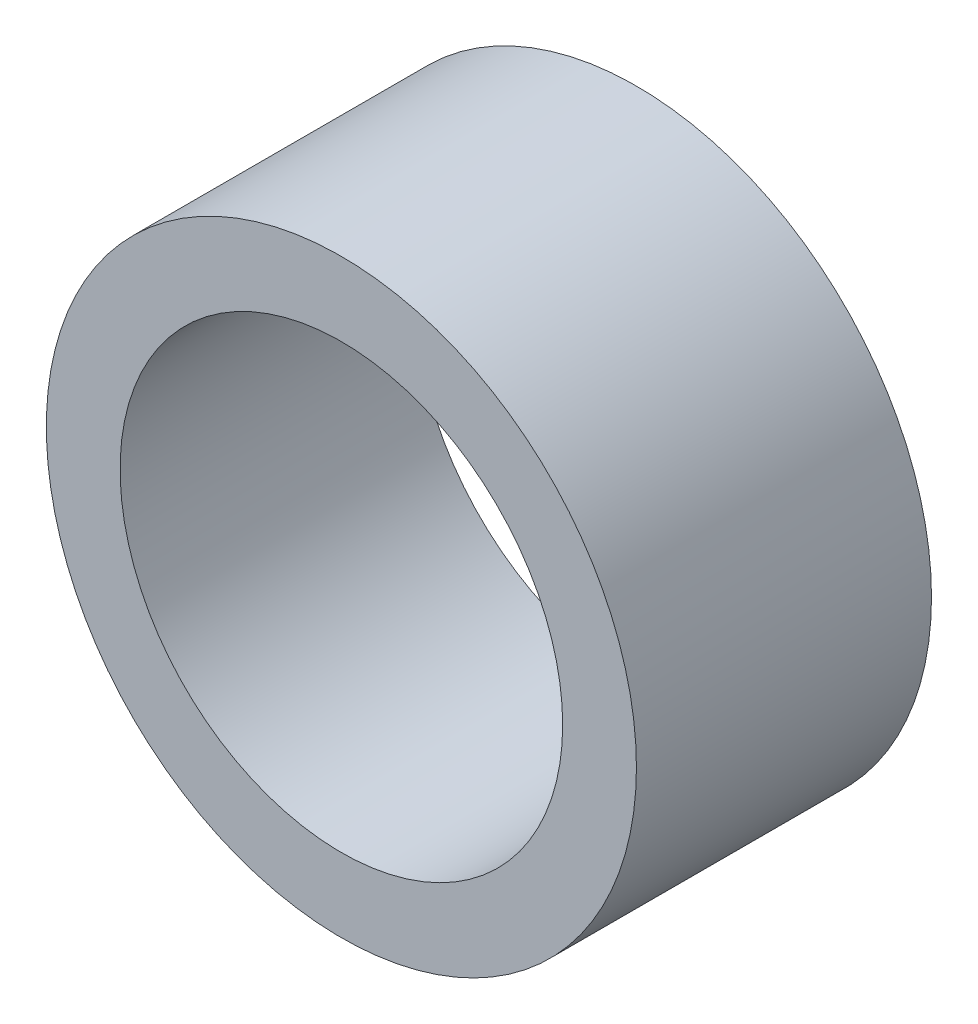
ISO-10303-21;
HEADER;
FILE_DESCRIPTION(('STEP AP214'),'2;1');
FILE_NAME('part.step','',(''),(''),'','','');
FILE_SCHEMA(('AUTOMOTIVE_DESIGN { 1 0 10303 214 1 1 1 1 }'));
ENDSEC;
DATA;
#1=APPLICATION_CONTEXT('core data for automotive mechanical design processes');
#2=APPLICATION_PROTOCOL_DEFINITION('international standard','automotive_design',2000,#1);
#3=PRODUCT_CONTEXT('',#1,'mechanical');
#4=PRODUCT('Part','Part','',(#3));
#5=PRODUCT_RELATED_PRODUCT_CATEGORY('part','',(#4));
#6=PRODUCT_DEFINITION_FORMATION('','',#4);
#7=PRODUCT_DEFINITION_CONTEXT('part definition',#1,'design');
#8=PRODUCT_DEFINITION('design','',#6,#7);
#9=PRODUCT_DEFINITION_SHAPE('','',#8);
#10=(LENGTH_UNIT() NAMED_UNIT(*) SI_UNIT(.MILLI.,.METRE.));
#11=(NAMED_UNIT(*) PLANE_ANGLE_UNIT() SI_UNIT($,.RADIAN.));
#12=(NAMED_UNIT(*) SI_UNIT($,.STERADIAN.) SOLID_ANGLE_UNIT());
#13=UNCERTAINTY_MEASURE_WITH_UNIT(LENGTH_MEASURE(1.E-05),#10,'distance_accuracy_value','');
#14=(GEOMETRIC_REPRESENTATION_CONTEXT(3) GLOBAL_UNCERTAINTY_ASSIGNED_CONTEXT((#13)) GLOBAL_UNIT_ASSIGNED_CONTEXT((#10,
#11,#12)) REPRESENTATION_CONTEXT('',''));
#15=CARTESIAN_POINT('',(0.,0.,0.));
#16=DIRECTION('',(0.,0.,1.));
#17=DIRECTION('',(1.,0.,0.));
#18=AXIS2_PLACEMENT_3D('',#15,#16,#17);
#19=CARTESIAN_POINT('',(0.,0.,4.));
#20=DIRECTION('',(0.,0.,-1.));
#21=DIRECTION('',(-1.,0.,0.));
#22=AXIS2_PLACEMENT_3D('',#19,#20,#21);
#23=CYLINDRICAL_SURFACE('',#22,4.);
#24=CARTESIAN_POINT('',(0.,0.,4.));
#25=DIRECTION('',(0.,0.,1.));
#26=DIRECTION('',(1.,0.,0.));
#27=AXIS2_PLACEMENT_3D('',#24,#25,#26);
#28=CIRCLE('',#27,4.);
#29=CARTESIAN_POINT('',(4.,0.,4.));
#30=VERTEX_POINT('',#29);
#31=EDGE_CURVE('E10',#30,#30,#28,.T.);
#32=ORIENTED_EDGE('',*,*,#31,.F.);
#33=EDGE_LOOP('',(#32));
#34=FACE_BOUND('',#33,.T.);
#35=CARTESIAN_POINT('',(0.,0.,0.));
#36=DIRECTION('',(0.,0.,1.));
#37=DIRECTION('',(1.,0.,0.));
#38=AXIS2_PLACEMENT_3D('',#35,#36,#37);
#39=CIRCLE('',#38,4.);
#40=CARTESIAN_POINT('',(4.,0.,0.));
#41=VERTEX_POINT('',#40);
#42=EDGE_CURVE('E42',#41,#41,#39,.T.);
#43=ORIENTED_EDGE('',*,*,#42,.T.);
#44=EDGE_LOOP('',(#43));
#45=FACE_BOUND('',#44,.T.);
#46=ADVANCED_FACE('F39',(#34,#45),#23,.T.);
#47=CARTESIAN_POINT('',(0.,0.,4.));
#48=DIRECTION('',(0.,0.,1.));
#49=DIRECTION('',(1.,0.,0.));
#50=AXIS2_PLACEMENT_3D('',#47,#48,#49);
#51=PLANE('',#50);
#52=CARTESIAN_POINT('',(0.,0.,4.));
#53=DIRECTION('',(0.,0.,1.));
#54=DIRECTION('',(1.,0.,0.));
#55=AXIS2_PLACEMENT_3D('',#52,#53,#54);
#56=CIRCLE('',#55,3.);
#57=CARTESIAN_POINT('',(3.,0.,4.));
#58=VERTEX_POINT('',#57);
#59=EDGE_CURVE('E51',#58,#58,#56,.T.);
#60=ORIENTED_EDGE('',*,*,#59,.F.);
#61=EDGE_LOOP('',(#60));
#62=FACE_BOUND('',#61,.T.);
#63=ORIENTED_EDGE('',*,*,#31,.T.);
#64=EDGE_LOOP('',(#63));
#65=FACE_BOUND('',#64,.T.);
#66=ADVANCED_FACE('F66',(#62,#65),#51,.T.);
#67=CARTESIAN_POINT('',(0.,0.,0.));
#68=DIRECTION('',(0.,0.,1.));
#69=DIRECTION('',(1.,0.,0.));
#70=AXIS2_PLACEMENT_3D('',#67,#68,#69);
#71=PLANE('',#70);
#72=CARTESIAN_POINT('',(0.,0.,0.));
#73=DIRECTION('',(0.,0.,1.));
#74=DIRECTION('',(1.,0.,0.));
#75=AXIS2_PLACEMENT_3D('',#72,#73,#74);
#76=CIRCLE('',#75,3.);
#77=CARTESIAN_POINT('',(3.,0.,0.));
#78=VERTEX_POINT('',#77);
#79=EDGE_CURVE('E49',#78,#78,#76,.T.);
#80=ORIENTED_EDGE('',*,*,#79,.T.);
#81=EDGE_LOOP('',(#80));
#82=FACE_BOUND('',#81,.T.);
#83=ORIENTED_EDGE('',*,*,#42,.F.);
#84=EDGE_LOOP('',(#83));
#85=FACE_BOUND('',#84,.T.);
#86=ADVANCED_FACE('F57',(#82,#85),#71,.F.);
#87=CARTESIAN_POINT('',(0.,0.,0.));
#88=DIRECTION('',(0.,0.,1.));
#89=DIRECTION('',(1.,0.,0.));
#90=AXIS2_PLACEMENT_3D('',#87,#88,#89);
#91=CYLINDRICAL_SURFACE('',#90,3.);
#92=ORIENTED_EDGE('',*,*,#79,.F.);
#93=EDGE_LOOP('',(#92));
#94=FACE_BOUND('',#93,.T.);
#95=ORIENTED_EDGE('',*,*,#59,.T.);
#96=EDGE_LOOP('',(#95));
#97=FACE_BOUND('',#96,.T.);
#98=ADVANCED_FACE('F60',(#94,#97),#91,.F.);
#99=CLOSED_SHELL('',(#46,#66,#86,#98));
#100=MANIFOLD_SOLID_BREP('B2',#99);
#101=ADVANCED_BREP_SHAPE_REPRESENTATION('',(#18,#100),#14);
#102=SHAPE_DEFINITION_REPRESENTATION(#9,#101);
ENDSEC;
END-ISO-10303-21;
